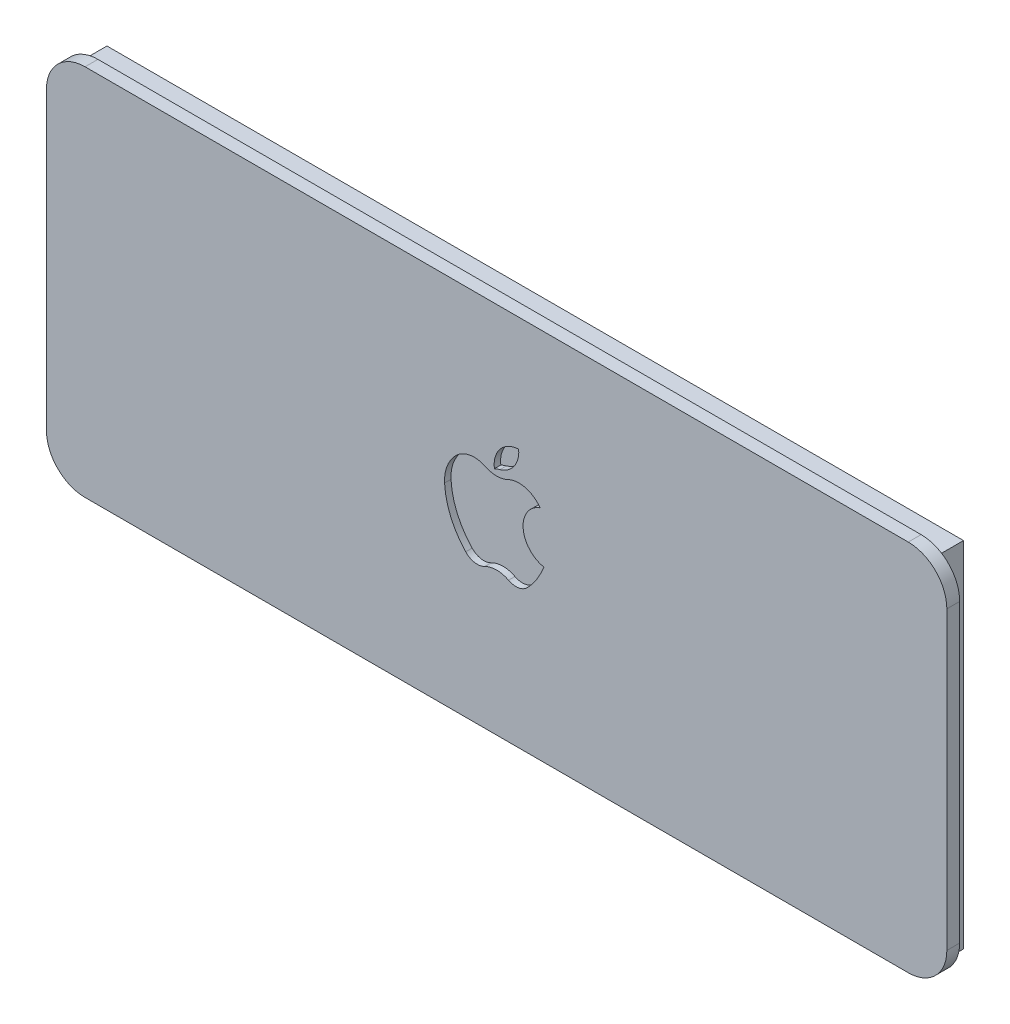
ISO-10303-21;
HEADER;
FILE_DESCRIPTION(('STEP AP214'),'2;1');
FILE_NAME('part.step','',(''),(''),'','','');
FILE_SCHEMA(('AUTOMOTIVE_DESIGN { 1 0 10303 214 1 1 1 1 }'));
ENDSEC;
DATA;
#1=APPLICATION_CONTEXT('core data for automotive mechanical design processes');
#2=APPLICATION_PROTOCOL_DEFINITION('international standard','automotive_design',2000,#1);
#3=PRODUCT_CONTEXT('',#1,'mechanical');
#4=PRODUCT('Part','Part','',(#3));
#5=PRODUCT_RELATED_PRODUCT_CATEGORY('part','',(#4));
#6=PRODUCT_DEFINITION_FORMATION('','',#4);
#7=PRODUCT_DEFINITION_CONTEXT('part definition',#1,'design');
#8=PRODUCT_DEFINITION('design','',#6,#7);
#9=PRODUCT_DEFINITION_SHAPE('','',#8);
#10=(LENGTH_UNIT() NAMED_UNIT(*) SI_UNIT(.MILLI.,.METRE.));
#11=(NAMED_UNIT(*) PLANE_ANGLE_UNIT() SI_UNIT($,.RADIAN.));
#12=(NAMED_UNIT(*) SI_UNIT($,.STERADIAN.) SOLID_ANGLE_UNIT());
#13=UNCERTAINTY_MEASURE_WITH_UNIT(LENGTH_MEASURE(1.E-05),#10,'distance_accuracy_value','');
#14=(GEOMETRIC_REPRESENTATION_CONTEXT(3) GLOBAL_UNCERTAINTY_ASSIGNED_CONTEXT((#13)) GLOBAL_UNIT_ASSIGNED_CONTEXT((#10,
#11,#12)) REPRESENTATION_CONTEXT('',''));
#15=CARTESIAN_POINT('',(0.,0.,0.));
#16=DIRECTION('',(0.,0.,1.));
#17=DIRECTION('',(1.,0.,0.));
#18=AXIS2_PLACEMENT_3D('',#15,#16,#17);
#19=CARTESIAN_POINT('',(-64.,-23.,0.));
#20=DIRECTION('',(0.,0.,-1.));
#21=DIRECTION('',(-1.,0.,0.));
#22=AXIS2_PLACEMENT_3D('',#19,#20,#21);
#23=PLANE('',#22);
#24=CARTESIAN_POINT('',(-64.,-23.,0.));
#25=DIRECTION('',(0.,0.,1.));
#26=DIRECTION('',(-1.,0.,0.));
#27=AXIS2_PLACEMENT_3D('',#24,#25,#26);
#28=CIRCLE('',#27,6.);
#29=CARTESIAN_POINT('',(-70.,-23.,0.));
#30=VERTEX_POINT('',#29);
#31=CARTESIAN_POINT('',(-64.,-29.,0.));
#32=VERTEX_POINT('',#31);
#33=EDGE_CURVE('E407',#30,#32,#28,.T.);
#34=ORIENTED_EDGE('',*,*,#33,.F.);
#35=DIRECTION('',(0.,-1.,0.));
#36=VECTOR('',#35,1.);
#37=CARTESIAN_POINT('',(-70.,23.,0.));
#38=LINE('',#37,#36);
#39=CARTESIAN_POINT('',(-70.,23.,0.));
#40=VERTEX_POINT('',#39);
#41=EDGE_CURVE('E416',#40,#30,#38,.T.);
#42=ORIENTED_EDGE('',*,*,#41,.F.);
#43=CARTESIAN_POINT('',(-64.,23.,0.));
#44=DIRECTION('',(0.,0.,1.));
#45=DIRECTION('',(-1.,0.,0.));
#46=AXIS2_PLACEMENT_3D('',#43,#44,#45);
#47=CIRCLE('',#46,6.);
#48=CARTESIAN_POINT('',(-64.,29.,0.));
#49=VERTEX_POINT('',#48);
#50=EDGE_CURVE('E443',#49,#40,#47,.T.);
#51=ORIENTED_EDGE('',*,*,#50,.F.);
#52=DIRECTION('',(-1.,0.,0.));
#53=VECTOR('',#52,1.);
#54=CARTESIAN_POINT('',(-64.,29.,0.));
#55=LINE('',#54,#53);
#56=CARTESIAN_POINT('',(64.,29.,0.));
#57=VERTEX_POINT('',#56);
#58=EDGE_CURVE('E441',#57,#49,#55,.T.);
#59=ORIENTED_EDGE('',*,*,#58,.F.);
#60=CARTESIAN_POINT('',(64.,23.,0.));
#61=DIRECTION('',(0.,0.,1.));
#62=DIRECTION('',(-1.,0.,0.));
#63=AXIS2_PLACEMENT_3D('',#60,#61,#62);
#64=CIRCLE('',#63,5.99999999999999);
#65=CARTESIAN_POINT('',(70.,23.,0.));
#66=VERTEX_POINT('',#65);
#67=EDGE_CURVE('E439',#66,#57,#64,.T.);
#68=ORIENTED_EDGE('',*,*,#67,.F.);
#69=DIRECTION('',(0.,1.,0.));
#70=VECTOR('',#69,1.);
#71=CARTESIAN_POINT('',(70.,23.,0.));
#72=LINE('',#71,#70);
#73=CARTESIAN_POINT('',(70.,-23.,0.));
#74=VERTEX_POINT('',#73);
#75=EDGE_CURVE('E437',#74,#66,#72,.T.);
#76=ORIENTED_EDGE('',*,*,#75,.F.);
#77=CARTESIAN_POINT('',(64.,-23.,0.));
#78=DIRECTION('',(0.,0.,1.));
#79=DIRECTION('',(1.,0.,0.));
#80=AXIS2_PLACEMENT_3D('',#77,#78,#79);
#81=CIRCLE('',#80,6.);
#82=CARTESIAN_POINT('',(64.,-29.,0.));
#83=VERTEX_POINT('',#82);
#84=EDGE_CURVE('E435',#83,#74,#81,.T.);
#85=ORIENTED_EDGE('',*,*,#84,.F.);
#86=DIRECTION('',(1.,0.,0.));
#87=VECTOR('',#86,1.);
#88=CARTESIAN_POINT('',(-64.,-29.,0.));
#89=LINE('',#88,#87);
#90=EDGE_CURVE('E433',#32,#83,#89,.T.);
#91=ORIENTED_EDGE('',*,*,#90,.F.);
#92=EDGE_LOOP('',(#34,#42,#51,#59,#68,#76,#85,#91));
#93=FACE_BOUND('',#92,.T.);
#94=DIRECTION('',(1.,0.,0.));
#95=VECTOR('',#94,1.);
#96=CARTESIAN_POINT('',(66.595,27.5,0.));
#97=LINE('',#96,#95);
#98=CARTESIAN_POINT('',(-66.595,27.5,0.));
#99=VERTEX_POINT('',#98);
#100=CARTESIAN_POINT('',(66.595,27.5,0.));
#101=VERTEX_POINT('',#100);
#102=EDGE_CURVE('E286',#99,#101,#97,.T.);
#103=ORIENTED_EDGE('',*,*,#102,.F.);
#104=DIRECTION('',(0.,1.,0.));
#105=VECTOR('',#104,1.);
#106=CARTESIAN_POINT('',(-66.595,27.5,0.));
#107=LINE('',#106,#105);
#108=CARTESIAN_POINT('',(-66.595,-27.5,0.));
#109=VERTEX_POINT('',#108);
#110=EDGE_CURVE('E251',#109,#99,#107,.T.);
#111=ORIENTED_EDGE('',*,*,#110,.F.);
#112=DIRECTION('',(-1.,0.,0.));
#113=VECTOR('',#112,1.);
#114=CARTESIAN_POINT('',(66.595,-27.5,0.));
#115=LINE('',#114,#113);
#116=CARTESIAN_POINT('',(66.595,-27.5,0.));
#117=VERTEX_POINT('',#116);
#118=EDGE_CURVE('E277',#117,#109,#115,.T.);
#119=ORIENTED_EDGE('',*,*,#118,.F.);
#120=DIRECTION('',(0.,-1.,0.));
#121=VECTOR('',#120,1.);
#122=CARTESIAN_POINT('',(66.595,27.5,0.));
#123=LINE('',#122,#121);
#124=EDGE_CURVE('E288',#101,#117,#123,.T.);
#125=ORIENTED_EDGE('',*,*,#124,.F.);
#126=EDGE_LOOP('',(#103,#111,#119,#125));
#127=FACE_BOUND('',#126,.T.);
#128=ADVANCED_FACE('F35',(#93,#127),#23,.T.);
#129=CARTESIAN_POINT('',(-64.,-23.,2.));
#130=DIRECTION('',(0.,0.,-1.));
#131=DIRECTION('',(-1.,0.,0.));
#132=AXIS2_PLACEMENT_3D('',#129,#130,#131);
#133=PLANE('',#132);
#134=CARTESIAN_POINT('',(3.00000000000302,-4.99999999999894,2.));
#135=DIRECTION('',(0.,0.,1.));
#136=DIRECTION('',(1.,0.,0.));
#137=AXIS2_PLACEMENT_3D('',#134,#135,#136);
#138=CIRCLE('',#137,2.5);
#139=CARTESIAN_POINT('',(1.84615384615686,-7.21780049897409,2.));
#140=VERTEX_POINT('',#139);
#141=CARTESIAN_POINT('',(4.81172183967402,-6.7226909112361,2.));
#142=VERTEX_POINT('',#141);
#143=EDGE_CURVE('E336',#140,#142,#138,.T.);
#144=ORIENTED_EDGE('',*,*,#143,.F.);
#145=CARTESIAN_POINT('',(3.01733464602716E-12,-10.7662812973343,2.));
#146=DIRECTION('',(0.,0.,-1.));
#147=DIRECTION('',(1.,0.,0.));
#148=AXIS2_PLACEMENT_3D('',#145,#146,#147);
#149=CIRCLE('',#148,4.);
#150=CARTESIAN_POINT('',(-1.84615384615083,-7.21780049897409,2.));
#151=VERTEX_POINT('',#150);
#152=EDGE_CURVE('E299',#151,#140,#149,.T.);
#153=ORIENTED_EDGE('',*,*,#152,.F.);
#154=CARTESIAN_POINT('',(-2.99999999999698,-4.99999999999894,2.));
#155=DIRECTION('',(0.,0.,1.));
#156=DIRECTION('',(-1.,0.,0.));
#157=AXIS2_PLACEMENT_3D('',#154,#155,#156);
#158=CIRCLE('',#157,2.5);
#159=CARTESIAN_POINT('',(-4.81172183966798,-6.7226909112361,2.));
#160=VERTEX_POINT('',#159);
#161=EDGE_CURVE('E304',#160,#151,#158,.T.);
#162=ORIENTED_EDGE('',*,*,#161,.F.);
#163=CARTESIAN_POINT('',(3.88454299074971,1.54622546270555,2.));
#164=DIRECTION('',(0.,0.,1.));
#165=DIRECTION('',(1.,0.,0.));
#166=AXIS2_PLACEMENT_3D('',#163,#164,#165);
#167=CIRCLE('',#166,12.0000000000001);
#168=CARTESIAN_POINT('',(-8.09823615563702,0.903571645381691,2.));
#169=VERTEX_POINT('',#168);
#170=EDGE_CURVE('E360',#169,#160,#167,.T.);
#171=ORIENTED_EDGE('',*,*,#170,.F.);
#172=CARTESIAN_POINT('',(-2.10684658244364,1.22489855404145,2.));
#173=DIRECTION('',(0.,0.,1.));
#174=DIRECTION('',(1.,0.,0.));
#175=AXIS2_PLACEMENT_3D('',#172,#173,#174);
#176=CIRCLE('',#175,6.00000000000002);
#177=CARTESIAN_POINT('',(-6.21130683511307,5.60135899991058,2.));
#178=VERTEX_POINT('',#177);
#179=EDGE_CURVE('E357',#178,#169,#176,.T.);
#180=ORIENTED_EDGE('',*,*,#179,.F.);
#181=CARTESIAN_POINT('',(-3.475,2.6837187026646,2.));
#182=DIRECTION('',(0.,0.,1.));
#183=DIRECTION('',(1.,0.,0.));
#184=AXIS2_PLACEMENT_3D('',#181,#182,#183);
#185=CIRCLE('',#184,4.00000000000002);
#186=CARTESIAN_POINT('',(-1.73749999999999,6.28664719904086,2.));
#187=VERTEX_POINT('',#186);
#188=EDGE_CURVE('E354',#187,#178,#185,.T.);
#189=ORIENTED_EDGE('',*,*,#188,.F.);
#190=CARTESIAN_POINT('',(-2.85177697428862E-11,9.88957569543071,2.));
#191=DIRECTION('',(0.,0.,-1.));
#192=DIRECTION('',(1.,0.,0.));
#193=AXIS2_PLACEMENT_3D('',#190,#191,#192);
#194=CIRCLE('',#193,3.99999999999988);
#195=CARTESIAN_POINT('',(1.73749999997143,6.28664719905457,2.));
#196=VERTEX_POINT('',#195);
#197=EDGE_CURVE('E351',#196,#187,#194,.T.);
#198=ORIENTED_EDGE('',*,*,#197,.F.);
#199=CARTESIAN_POINT('',(3.47500000026505,2.68371870281979,2.));
#200=DIRECTION('',(0.,0.,1.));
#201=DIRECTION('',(-1.,0.,0.));
#202=AXIS2_PLACEMENT_3D('',#199,#200,#201);
#203=CIRCLE('',#202,4.00000000000012);
#204=CARTESIAN_POINT('',(6.21130683554235,5.60135899991189,2.));
#205=VERTEX_POINT('',#204);
#206=EDGE_CURVE('E348',#205,#196,#203,.T.);
#207=ORIENTED_EDGE('',*,*,#206,.F.);
#208=CARTESIAN_POINT('',(2.10684658287288,1.22489855404202,2.));
#209=DIRECTION('',(0.,0.,1.));
#210=DIRECTION('',(-1.,0.,0.));
#211=AXIS2_PLACEMENT_3D('',#208,#209,#210);
#212=CIRCLE('',#211,6.00000000000059);
#213=CARTESIAN_POINT('',(6.77351324954047,4.99613472037007,2.));
#214=VERTEX_POINT('',#213);
#215=EDGE_CURVE('E345',#214,#205,#212,.T.);
#216=ORIENTED_EDGE('',*,*,#215,.F.);
#217=CARTESIAN_POINT('',(8.10684658287352,1.22489855404202,2.));
#218=DIRECTION('',(0.,0.,-1.));
#219=DIRECTION('',(1.,0.,0.));
#220=AXIS2_PLACEMENT_3D('',#217,#218,#219);
#221=CIRCLE('',#220,3.99999999999972);
#222=CARTESIAN_POINT('',(7.3388179922104,-2.70067555478866,2.));
#223=VERTEX_POINT('',#222);
#224=EDGE_CURVE('E342',#223,#214,#221,.T.);
#225=ORIENTED_EDGE('',*,*,#224,.F.);
#226=CARTESIAN_POINT('',(-3.8845429902968,1.54622546318177,2.));
#227=DIRECTION('',(0.,0.,1.));
#228=DIRECTION('',(-1.,0.,0.));
#229=AXIS2_PLACEMENT_3D('',#226,#227,#228);
#230=CIRCLE('',#229,12.0000000000043);
#231=EDGE_CURVE('E339',#142,#223,#230,.T.);
#232=ORIENTED_EDGE('',*,*,#231,.F.);
#233=EDGE_LOOP('',(#144,#153,#162,#171,#180,#189,#198,#207,#216,#225,#232));
#234=FACE_BOUND('',#233,.T.);
#235=CARTESIAN_POINT('',(-64.,-23.,2.));
#236=DIRECTION('',(0.,0.,1.));
#237=DIRECTION('',(-1.,0.,0.));
#238=AXIS2_PLACEMENT_3D('',#235,#236,#237);
#239=CIRCLE('',#238,6.);
#240=CARTESIAN_POINT('',(-70.,-23.,2.));
#241=VERTEX_POINT('',#240);
#242=CARTESIAN_POINT('',(-64.,-29.,2.));
#243=VERTEX_POINT('',#242);
#244=EDGE_CURVE('E412',#241,#243,#239,.T.);
#245=ORIENTED_EDGE('',*,*,#244,.T.);
#246=DIRECTION('',(1.,0.,0.));
#247=VECTOR('',#246,1.);
#248=CARTESIAN_POINT('',(-64.,-29.,2.));
#249=LINE('',#248,#247);
#250=CARTESIAN_POINT('',(64.,-29.,2.));
#251=VERTEX_POINT('',#250);
#252=EDGE_CURVE('E415',#243,#251,#249,.T.);
#253=ORIENTED_EDGE('',*,*,#252,.T.);
#254=CARTESIAN_POINT('',(64.,-23.,2.));
#255=DIRECTION('',(0.,0.,1.));
#256=DIRECTION('',(1.,0.,0.));
#257=AXIS2_PLACEMENT_3D('',#254,#255,#256);
#258=CIRCLE('',#257,6.);
#259=CARTESIAN_POINT('',(70.,-23.,2.));
#260=VERTEX_POINT('',#259);
#261=EDGE_CURVE('E418',#251,#260,#258,.T.);
#262=ORIENTED_EDGE('',*,*,#261,.T.);
#263=DIRECTION('',(0.,1.,0.));
#264=VECTOR('',#263,1.);
#265=CARTESIAN_POINT('',(70.,23.,2.));
#266=LINE('',#265,#264);
#267=CARTESIAN_POINT('',(70.,23.,2.));
#268=VERTEX_POINT('',#267);
#269=EDGE_CURVE('E420',#260,#268,#266,.T.);
#270=ORIENTED_EDGE('',*,*,#269,.T.);
#271=CARTESIAN_POINT('',(64.,23.,2.));
#272=DIRECTION('',(0.,0.,1.));
#273=DIRECTION('',(-1.,0.,0.));
#274=AXIS2_PLACEMENT_3D('',#271,#272,#273);
#275=CIRCLE('',#274,5.99999999999999);
#276=CARTESIAN_POINT('',(64.,29.,2.));
#277=VERTEX_POINT('',#276);
#278=EDGE_CURVE('E422',#268,#277,#275,.T.);
#279=ORIENTED_EDGE('',*,*,#278,.T.);
#280=DIRECTION('',(-1.,0.,0.));
#281=VECTOR('',#280,1.);
#282=CARTESIAN_POINT('',(-64.,29.,2.));
#283=LINE('',#282,#281);
#284=CARTESIAN_POINT('',(-64.,29.,2.));
#285=VERTEX_POINT('',#284);
#286=EDGE_CURVE('E424',#277,#285,#283,.T.);
#287=ORIENTED_EDGE('',*,*,#286,.T.);
#288=CARTESIAN_POINT('',(-64.,23.,2.));
#289=DIRECTION('',(0.,0.,1.));
#290=DIRECTION('',(-1.,0.,0.));
#291=AXIS2_PLACEMENT_3D('',#288,#289,#290);
#292=CIRCLE('',#291,6.);
#293=CARTESIAN_POINT('',(-70.,23.,2.));
#294=VERTEX_POINT('',#293);
#295=EDGE_CURVE('E426',#285,#294,#292,.T.);
#296=ORIENTED_EDGE('',*,*,#295,.T.);
#297=DIRECTION('',(0.,-1.,0.));
#298=VECTOR('',#297,1.);
#299=CARTESIAN_POINT('',(-70.,23.,2.));
#300=LINE('',#299,#298);
#301=EDGE_CURVE('E428',#294,#241,#300,.T.);
#302=ORIENTED_EDGE('',*,*,#301,.T.);
#303=EDGE_LOOP('',(#245,#253,#262,#270,#279,#287,#296,#302));
#304=FACE_BOUND('',#303,.T.);
#305=CARTESIAN_POINT('',(2.10684658287288,1.22489855404202,2.));
#306=DIRECTION('',(0.,0.,-1.));
#307=DIRECTION('',(-1.,0.,0.));
#308=AXIS2_PLACEMENT_3D('',#305,#306,#307);
#309=CIRCLE('',#308,6.00000000000063);
#310=CARTESIAN_POINT('',(-0.354358224239168,6.69686994445116,2.));
#311=VERTEX_POINT('',#310);
#312=CARTESIAN_POINT('',(0.506524653439716,7.00754238901775,2.));
#313=VERTEX_POINT('',#312);
#314=EDGE_CURVE('E400',#311,#313,#309,.T.);
#315=ORIENTED_EDGE('',*,*,#314,.F.);
#316=CARTESIAN_POINT('',(3.61063683092017,7.22489855404166,2.));
#317=DIRECTION('',(0.,0.,1.));
#318=DIRECTION('',(1.,0.,0.));
#319=AXIS2_PLACEMENT_3D('',#316,#317,#318);
#320=CIRCLE('',#319,3.99999999999801);
#321=CARTESIAN_POINT('',(3.42360098065179,11.2205233600887,2.));
#322=VERTEX_POINT('',#321);
#323=EDGE_CURVE('E367',#322,#311,#320,.T.);
#324=ORIENTED_EDGE('',*,*,#323,.F.);
#325=CARTESIAN_POINT('',(-0.560356633303887,10.8626382790118,2.));
#326=DIRECTION('',(0.,0.,1.));
#327=DIRECTION('',(1.,0.,0.));
#328=AXIS2_PLACEMENT_3D('',#325,#326,#327);
#329=CIRCLE('',#328,4.0000000001316);
#330=EDGE_CURVE('E392',#313,#322,#329,.T.);
#331=ORIENTED_EDGE('',*,*,#330,.F.);
#332=EDGE_LOOP('',(#315,#324,#331));
#333=FACE_BOUND('',#332,.T.);
#334=ADVANCED_FACE('F486',(#234,#304,#333),#133,.F.);
#335=CARTESIAN_POINT('',(-64.,-23.,2.));
#336=DIRECTION('',(0.,0.,-1.));
#337=DIRECTION('',(-1.,0.,0.));
#338=AXIS2_PLACEMENT_3D('',#335,#336,#337);
#339=CYLINDRICAL_SURFACE('',#338,6.);
#340=ORIENTED_EDGE('',*,*,#33,.T.);
#341=DIRECTION('',(0.,0.,-1.));
#342=VECTOR('',#341,1.);
#343=CARTESIAN_POINT('',(-64.,-29.,2.));
#344=LINE('',#343,#342);
#345=EDGE_CURVE('E11',#243,#32,#344,.T.);
#346=ORIENTED_EDGE('',*,*,#345,.F.);
#347=ORIENTED_EDGE('',*,*,#244,.F.);
#348=DIRECTION('',(0.,0.,-1.));
#349=VECTOR('',#348,1.);
#350=CARTESIAN_POINT('',(-70.,-23.,2.));
#351=LINE('',#350,#349);
#352=EDGE_CURVE('E430',#241,#30,#351,.T.);
#353=ORIENTED_EDGE('',*,*,#352,.T.);
#354=EDGE_LOOP('',(#340,#346,#347,#353));
#355=FACE_BOUND('',#354,.T.);
#356=ADVANCED_FACE('F37',(#355),#339,.T.);
#357=CARTESIAN_POINT('',(-64.,-29.,2.));
#358=DIRECTION('',(0.,1.,0.));
#359=DIRECTION('',(0.,0.,1.));
#360=AXIS2_PLACEMENT_3D('',#357,#358,#359);
#361=PLANE('',#360);
#362=ORIENTED_EDGE('',*,*,#90,.T.);
#363=DIRECTION('',(0.,0.,-1.));
#364=VECTOR('',#363,1.);
#365=CARTESIAN_POINT('',(64.,-29.,2.));
#366=LINE('',#365,#364);
#367=EDGE_CURVE('E43',#251,#83,#366,.T.);
#368=ORIENTED_EDGE('',*,*,#367,.F.);
#369=ORIENTED_EDGE('',*,*,#252,.F.);
#370=ORIENTED_EDGE('',*,*,#345,.T.);
#371=EDGE_LOOP('',(#362,#368,#369,#370));
#372=FACE_BOUND('',#371,.T.);
#373=ADVANCED_FACE('F491',(#372),#361,.F.);
#374=CARTESIAN_POINT('',(64.,-23.,2.));
#375=DIRECTION('',(0.,0.,-1.));
#376=DIRECTION('',(-1.,0.,0.));
#377=AXIS2_PLACEMENT_3D('',#374,#375,#376);
#378=CYLINDRICAL_SURFACE('',#377,6.);
#379=ORIENTED_EDGE('',*,*,#84,.T.);
#380=DIRECTION('',(0.,0.,-1.));
#381=VECTOR('',#380,1.);
#382=CARTESIAN_POINT('',(70.,-23.,2.));
#383=LINE('',#382,#381);
#384=EDGE_CURVE('E460',#260,#74,#383,.T.);
#385=ORIENTED_EDGE('',*,*,#384,.F.);
#386=ORIENTED_EDGE('',*,*,#261,.F.);
#387=ORIENTED_EDGE('',*,*,#367,.T.);
#388=EDGE_LOOP('',(#379,#385,#386,#387));
#389=FACE_BOUND('',#388,.T.);
#390=ADVANCED_FACE('F467',(#389),#378,.T.);
#391=CARTESIAN_POINT('',(70.,23.,2.));
#392=DIRECTION('',(-1.,0.,0.));
#393=DIRECTION('',(0.,0.,1.));
#394=AXIS2_PLACEMENT_3D('',#391,#392,#393);
#395=PLANE('',#394);
#396=ORIENTED_EDGE('',*,*,#75,.T.);
#397=DIRECTION('',(0.,0.,-1.));
#398=VECTOR('',#397,1.);
#399=CARTESIAN_POINT('',(70.,23.,2.));
#400=LINE('',#399,#398);
#401=EDGE_CURVE('E457',#268,#66,#400,.T.);
#402=ORIENTED_EDGE('',*,*,#401,.F.);
#403=ORIENTED_EDGE('',*,*,#269,.F.);
#404=ORIENTED_EDGE('',*,*,#384,.T.);
#405=EDGE_LOOP('',(#396,#402,#403,#404));
#406=FACE_BOUND('',#405,.T.);
#407=ADVANCED_FACE('F478',(#406),#395,.F.);
#408=CARTESIAN_POINT('',(64.,23.,2.));
#409=DIRECTION('',(0.,0.,-1.));
#410=DIRECTION('',(-1.,0.,0.));
#411=AXIS2_PLACEMENT_3D('',#408,#409,#410);
#412=CYLINDRICAL_SURFACE('',#411,5.99999999999999);
#413=ORIENTED_EDGE('',*,*,#67,.T.);
#414=DIRECTION('',(0.,0.,-1.));
#415=VECTOR('',#414,1.);
#416=CARTESIAN_POINT('',(64.,29.,2.));
#417=LINE('',#416,#415);
#418=EDGE_CURVE('E454',#277,#57,#417,.T.);
#419=ORIENTED_EDGE('',*,*,#418,.F.);
#420=ORIENTED_EDGE('',*,*,#278,.F.);
#421=ORIENTED_EDGE('',*,*,#401,.T.);
#422=EDGE_LOOP('',(#413,#419,#420,#421));
#423=FACE_BOUND('',#422,.T.);
#424=ADVANCED_FACE('F482',(#423),#412,.T.);
#425=CARTESIAN_POINT('',(-64.,29.,2.));
#426=DIRECTION('',(0.,-1.,0.));
#427=DIRECTION('',(0.,0.,-1.));
#428=AXIS2_PLACEMENT_3D('',#425,#426,#427);
#429=PLANE('',#428);
#430=ORIENTED_EDGE('',*,*,#58,.T.);
#431=DIRECTION('',(0.,0.,-1.));
#432=VECTOR('',#431,1.);
#433=CARTESIAN_POINT('',(-64.,29.,2.));
#434=LINE('',#433,#432);
#435=EDGE_CURVE('E451',#285,#49,#434,.T.);
#436=ORIENTED_EDGE('',*,*,#435,.F.);
#437=ORIENTED_EDGE('',*,*,#286,.F.);
#438=ORIENTED_EDGE('',*,*,#418,.T.);
#439=EDGE_LOOP('',(#430,#436,#437,#438));
#440=FACE_BOUND('',#439,.T.);
#441=ADVANCED_FACE('F504',(#440),#429,.F.);
#442=CARTESIAN_POINT('',(-64.,23.,2.));
#443=DIRECTION('',(0.,0.,-1.));
#444=DIRECTION('',(-1.,0.,0.));
#445=AXIS2_PLACEMENT_3D('',#442,#443,#444);
#446=CYLINDRICAL_SURFACE('',#445,6.);
#447=ORIENTED_EDGE('',*,*,#50,.T.);
#448=DIRECTION('',(0.,0.,-1.));
#449=VECTOR('',#448,1.);
#450=CARTESIAN_POINT('',(-70.,23.,2.));
#451=LINE('',#450,#449);
#452=EDGE_CURVE('E448',#294,#40,#451,.T.);
#453=ORIENTED_EDGE('',*,*,#452,.F.);
#454=ORIENTED_EDGE('',*,*,#295,.F.);
#455=ORIENTED_EDGE('',*,*,#435,.T.);
#456=EDGE_LOOP('',(#447,#453,#454,#455));
#457=FACE_BOUND('',#456,.T.);
#458=ADVANCED_FACE('F502',(#457),#446,.T.);
#459=CARTESIAN_POINT('',(-70.,23.,2.));
#460=DIRECTION('',(1.,0.,0.));
#461=DIRECTION('',(0.,0.,-1.));
#462=AXIS2_PLACEMENT_3D('',#459,#460,#461);
#463=PLANE('',#462);
#464=ORIENTED_EDGE('',*,*,#41,.T.);
#465=ORIENTED_EDGE('',*,*,#352,.F.);
#466=ORIENTED_EDGE('',*,*,#301,.F.);
#467=ORIENTED_EDGE('',*,*,#452,.T.);
#468=EDGE_LOOP('',(#464,#465,#466,#467));
#469=FACE_BOUND('',#468,.T.);
#470=ADVANCED_FACE('F497',(#469),#463,.F.);
#471=CARTESIAN_POINT('',(3.61063683092017,7.22489855404166,1.));
#472=DIRECTION('',(0.,0.,1.));
#473=DIRECTION('',(1.,0.,0.));
#474=AXIS2_PLACEMENT_3D('',#471,#472,#473);
#475=CYLINDRICAL_SURFACE('',#474,3.99999999999801);
#476=ORIENTED_EDGE('',*,*,#323,.T.);
#477=DIRECTION('',(0.,0.,1.));
#478=VECTOR('',#477,1.);
#479=CARTESIAN_POINT('',(-0.354358224239168,6.69686994445116,1.));
#480=LINE('',#479,#478);
#481=CARTESIAN_POINT('',(-0.354358224239168,6.69686994445116,1.));
#482=VERTEX_POINT('',#481);
#483=EDGE_CURVE('E398',#482,#311,#480,.T.);
#484=ORIENTED_EDGE('',*,*,#483,.F.);
#485=CARTESIAN_POINT('',(3.61063683092017,7.22489855404166,1.));
#486=DIRECTION('',(0.,0.,1.));
#487=DIRECTION('',(1.,0.,0.));
#488=AXIS2_PLACEMENT_3D('',#485,#486,#487);
#489=CIRCLE('',#488,3.99999999999801);
#490=CARTESIAN_POINT('',(3.42360098065179,11.2205233600887,1.));
#491=VERTEX_POINT('',#490);
#492=EDGE_CURVE('E388',#491,#482,#489,.T.);
#493=ORIENTED_EDGE('',*,*,#492,.F.);
#494=DIRECTION('',(0.,0.,1.));
#495=VECTOR('',#494,1.);
#496=CARTESIAN_POINT('',(3.42360098065179,11.2205233600887,1.));
#497=LINE('',#496,#495);
#498=EDGE_CURVE('E405',#491,#322,#497,.T.);
#499=ORIENTED_EDGE('',*,*,#498,.T.);
#500=EDGE_LOOP('',(#476,#484,#493,#499));
#501=FACE_BOUND('',#500,.T.);
#502=ADVANCED_FACE('F615',(#501),#475,.F.);
#503=CARTESIAN_POINT('',(-0.560356633303887,10.8626382790118,1.));
#504=DIRECTION('',(0.,0.,1.));
#505=DIRECTION('',(1.,0.,0.));
#506=AXIS2_PLACEMENT_3D('',#503,#504,#505);
#507=CYLINDRICAL_SURFACE('',#506,4.0000000001316);
#508=ORIENTED_EDGE('',*,*,#330,.T.);
#509=ORIENTED_EDGE('',*,*,#498,.F.);
#510=CARTESIAN_POINT('',(-0.560356633303887,10.8626382790118,1.));
#511=DIRECTION('',(0.,0.,1.));
#512=DIRECTION('',(1.,0.,0.));
#513=AXIS2_PLACEMENT_3D('',#510,#511,#512);
#514=CIRCLE('',#513,4.0000000001316);
#515=CARTESIAN_POINT('',(0.506524653439716,7.00754238901775,1.));
#516=VERTEX_POINT('',#515);
#517=EDGE_CURVE('E395',#516,#491,#514,.T.);
#518=ORIENTED_EDGE('',*,*,#517,.F.);
#519=DIRECTION('',(0.,0.,1.));
#520=VECTOR('',#519,1.);
#521=CARTESIAN_POINT('',(0.506524653439716,7.00754238901775,1.));
#522=LINE('',#521,#520);
#523=EDGE_CURVE('E408',#516,#313,#522,.T.);
#524=ORIENTED_EDGE('',*,*,#523,.T.);
#525=EDGE_LOOP('',(#508,#509,#518,#524));
#526=FACE_BOUND('',#525,.T.);
#527=ADVANCED_FACE('F612',(#526),#507,.F.);
#528=CARTESIAN_POINT('',(2.10684658287288,1.22489855404202,1.));
#529=DIRECTION('',(0.,0.,1.));
#530=DIRECTION('',(1.,0.,0.));
#531=AXIS2_PLACEMENT_3D('',#528,#529,#530);
#532=CYLINDRICAL_SURFACE('',#531,6.00000000000063);
#533=ORIENTED_EDGE('',*,*,#314,.T.);
#534=ORIENTED_EDGE('',*,*,#523,.F.);
#535=CARTESIAN_POINT('',(2.10684658287288,1.22489855404202,1.));
#536=DIRECTION('',(0.,0.,-1.));
#537=DIRECTION('',(-1.,0.,0.));
#538=AXIS2_PLACEMENT_3D('',#535,#536,#537);
#539=CIRCLE('',#538,6.00000000000063);
#540=EDGE_CURVE('E391',#482,#516,#539,.T.);
#541=ORIENTED_EDGE('',*,*,#540,.F.);
#542=ORIENTED_EDGE('',*,*,#483,.T.);
#543=EDGE_LOOP('',(#533,#534,#541,#542));
#544=FACE_BOUND('',#543,.T.);
#545=ADVANCED_FACE('F610',(#544),#532,.T.);
#546=CARTESIAN_POINT('',(2.85874170689653,4.22489855404184,1.));
#547=DIRECTION('',(0.,0.,1.));
#548=DIRECTION('',(1.,0.,0.));
#549=AXIS2_PLACEMENT_3D('',#546,#547,#548);
#550=PLANE('',#549);
#551=ORIENTED_EDGE('',*,*,#492,.T.);
#552=ORIENTED_EDGE('',*,*,#540,.T.);
#553=ORIENTED_EDGE('',*,*,#517,.T.);
#554=EDGE_LOOP('',(#551,#552,#553));
#555=FACE_BOUND('',#554,.T.);
#556=ADVANCED_FACE('F606',(#555),#550,.T.);
#557=CARTESIAN_POINT('',(3.01733464602716E-12,-10.7662812973343,1.));
#558=DIRECTION('',(0.,0.,1.));
#559=DIRECTION('',(1.,0.,0.));
#560=AXIS2_PLACEMENT_3D('',#557,#558,#559);
#561=CYLINDRICAL_SURFACE('',#560,4.);
#562=ORIENTED_EDGE('',*,*,#152,.T.);
#563=DIRECTION('',(0.,0.,1.));
#564=VECTOR('',#563,1.);
#565=CARTESIAN_POINT('',(1.84615384615686,-7.21780049897409,1.));
#566=LINE('',#565,#564);
#567=CARTESIAN_POINT('',(1.84615384615686,-7.21780049897409,1.));
#568=VERTEX_POINT('',#567);
#569=EDGE_CURVE('E334',#568,#140,#566,.T.);
#570=ORIENTED_EDGE('',*,*,#569,.F.);
#571=CARTESIAN_POINT('',(3.01733464602716E-12,-10.7662812973343,1.));
#572=DIRECTION('',(0.,0.,-1.));
#573=DIRECTION('',(1.,0.,0.));
#574=AXIS2_PLACEMENT_3D('',#571,#572,#573);
#575=CIRCLE('',#574,4.);
#576=CARTESIAN_POINT('',(-1.84615384615083,-7.21780049897409,1.));
#577=VERTEX_POINT('',#576);
#578=EDGE_CURVE('E300',#577,#568,#575,.T.);
#579=ORIENTED_EDGE('',*,*,#578,.F.);
#580=DIRECTION('',(0.,0.,1.));
#581=VECTOR('',#580,1.);
#582=CARTESIAN_POINT('',(-1.84615384615083,-7.21780049897409,1.));
#583=LINE('',#582,#581);
#584=EDGE_CURVE('E365',#577,#151,#583,.T.);
#585=ORIENTED_EDGE('',*,*,#584,.T.);
#586=EDGE_LOOP('',(#562,#570,#579,#585));
#587=FACE_BOUND('',#586,.T.);
#588=ADVANCED_FACE('F568',(#587),#561,.T.);
#589=CARTESIAN_POINT('',(-2.99999999999698,-4.99999999999894,1.));
#590=DIRECTION('',(0.,0.,1.));
#591=DIRECTION('',(1.,0.,0.));
#592=AXIS2_PLACEMENT_3D('',#589,#590,#591);
#593=CYLINDRICAL_SURFACE('',#592,2.5);
#594=ORIENTED_EDGE('',*,*,#161,.T.);
#595=ORIENTED_EDGE('',*,*,#584,.F.);
#596=CARTESIAN_POINT('',(-2.99999999999698,-4.99999999999894,1.));
#597=DIRECTION('',(0.,0.,1.));
#598=DIRECTION('',(-1.,0.,0.));
#599=AXIS2_PLACEMENT_3D('',#596,#597,#598);
#600=CIRCLE('',#599,2.5);
#601=CARTESIAN_POINT('',(-4.81172183966798,-6.7226909112361,1.));
#602=VERTEX_POINT('',#601);
#603=EDGE_CURVE('E331',#602,#577,#600,.T.);
#604=ORIENTED_EDGE('',*,*,#603,.F.);
#605=DIRECTION('',(0.,0.,1.));
#606=VECTOR('',#605,1.);
#607=CARTESIAN_POINT('',(-4.81172183966798,-6.7226909112361,1.));
#608=LINE('',#607,#606);
#609=EDGE_CURVE('E368',#602,#160,#608,.T.);
#610=ORIENTED_EDGE('',*,*,#609,.T.);
#611=EDGE_LOOP('',(#594,#595,#604,#610));
#612=FACE_BOUND('',#611,.T.);
#613=ADVANCED_FACE('F564',(#612),#593,.F.);
#614=CARTESIAN_POINT('',(3.88454299074971,1.54622546270555,1.));
#615=DIRECTION('',(0.,0.,1.));
#616=DIRECTION('',(1.,0.,0.));
#617=AXIS2_PLACEMENT_3D('',#614,#615,#616);
#618=CYLINDRICAL_SURFACE('',#617,12.0000000000001);
#619=ORIENTED_EDGE('',*,*,#170,.T.);
#620=ORIENTED_EDGE('',*,*,#609,.F.);
#621=CARTESIAN_POINT('',(3.88454299074971,1.54622546270555,1.));
#622=DIRECTION('',(0.,0.,1.));
#623=DIRECTION('',(1.,0.,0.));
#624=AXIS2_PLACEMENT_3D('',#621,#622,#623);
#625=CIRCLE('',#624,12.0000000000001);
#626=CARTESIAN_POINT('',(-8.09823615563702,0.903571645381691,1.));
#627=VERTEX_POINT('',#626);
#628=EDGE_CURVE('E328',#627,#602,#625,.T.);
#629=ORIENTED_EDGE('',*,*,#628,.F.);
#630=DIRECTION('',(0.,0.,1.));
#631=VECTOR('',#630,1.);
#632=CARTESIAN_POINT('',(-8.09823615563702,0.903571645381691,1.));
#633=LINE('',#632,#631);
#634=EDGE_CURVE('E370',#627,#169,#633,.T.);
#635=ORIENTED_EDGE('',*,*,#634,.T.);
#636=EDGE_LOOP('',(#619,#620,#629,#635));
#637=FACE_BOUND('',#636,.T.);
#638=ADVANCED_FACE('F567',(#637),#618,.F.);
#639=CARTESIAN_POINT('',(-2.10684658244364,1.22489855404145,1.));
#640=DIRECTION('',(0.,0.,1.));
#641=DIRECTION('',(1.,0.,0.));
#642=AXIS2_PLACEMENT_3D('',#639,#640,#641);
#643=CYLINDRICAL_SURFACE('',#642,6.00000000000002);
#644=ORIENTED_EDGE('',*,*,#179,.T.);
#645=ORIENTED_EDGE('',*,*,#634,.F.);
#646=CARTESIAN_POINT('',(-2.10684658244364,1.22489855404145,1.));
#647=DIRECTION('',(0.,0.,1.));
#648=DIRECTION('',(1.,0.,0.));
#649=AXIS2_PLACEMENT_3D('',#646,#647,#648);
#650=CIRCLE('',#649,6.00000000000002);
#651=CARTESIAN_POINT('',(-6.21130683511307,5.60135899991058,1.));
#652=VERTEX_POINT('',#651);
#653=EDGE_CURVE('E325',#652,#627,#650,.T.);
#654=ORIENTED_EDGE('',*,*,#653,.F.);
#655=DIRECTION('',(0.,0.,1.));
#656=VECTOR('',#655,1.);
#657=CARTESIAN_POINT('',(-6.21130683511307,5.60135899991058,1.));
#658=LINE('',#657,#656);
#659=EDGE_CURVE('E372',#652,#178,#658,.T.);
#660=ORIENTED_EDGE('',*,*,#659,.T.);
#661=EDGE_LOOP('',(#644,#645,#654,#660));
#662=FACE_BOUND('',#661,.T.);
#663=ADVANCED_FACE('F572',(#662),#643,.F.);
#664=CARTESIAN_POINT('',(-3.475,2.6837187026646,1.));
#665=DIRECTION('',(0.,0.,1.));
#666=DIRECTION('',(1.,0.,0.));
#667=AXIS2_PLACEMENT_3D('',#664,#665,#666);
#668=CYLINDRICAL_SURFACE('',#667,4.00000000000002);
#669=ORIENTED_EDGE('',*,*,#188,.T.);
#670=ORIENTED_EDGE('',*,*,#659,.F.);
#671=CARTESIAN_POINT('',(-3.475,2.6837187026646,1.));
#672=DIRECTION('',(0.,0.,1.));
#673=DIRECTION('',(1.,0.,0.));
#674=AXIS2_PLACEMENT_3D('',#671,#672,#673);
#675=CIRCLE('',#674,4.00000000000002);
#676=CARTESIAN_POINT('',(-1.73749999999999,6.28664719904086,1.));
#677=VERTEX_POINT('',#676);
#678=EDGE_CURVE('E322',#677,#652,#675,.T.);
#679=ORIENTED_EDGE('',*,*,#678,.F.);
#680=DIRECTION('',(0.,0.,1.));
#681=VECTOR('',#680,1.);
#682=CARTESIAN_POINT('',(-1.73749999999999,6.28664719904086,1.));
#683=LINE('',#682,#681);
#684=EDGE_CURVE('E374',#677,#187,#683,.T.);
#685=ORIENTED_EDGE('',*,*,#684,.T.);
#686=EDGE_LOOP('',(#669,#670,#679,#685));
#687=FACE_BOUND('',#686,.T.);
#688=ADVANCED_FACE('F576',(#687),#668,.F.);
#689=CARTESIAN_POINT('',(-2.85177697428862E-11,9.88957569543071,1.));
#690=DIRECTION('',(0.,0.,1.));
#691=DIRECTION('',(1.,0.,0.));
#692=AXIS2_PLACEMENT_3D('',#689,#690,#691);
#693=CYLINDRICAL_SURFACE('',#692,3.99999999999988);
#694=ORIENTED_EDGE('',*,*,#197,.T.);
#695=ORIENTED_EDGE('',*,*,#684,.F.);
#696=CARTESIAN_POINT('',(-2.85177697428862E-11,9.88957569543071,1.));
#697=DIRECTION('',(0.,0.,-1.));
#698=DIRECTION('',(1.,0.,0.));
#699=AXIS2_PLACEMENT_3D('',#696,#697,#698);
#700=CIRCLE('',#699,3.99999999999988);
#701=CARTESIAN_POINT('',(1.73749999997143,6.28664719905457,1.));
#702=VERTEX_POINT('',#701);
#703=EDGE_CURVE('E319',#702,#677,#700,.T.);
#704=ORIENTED_EDGE('',*,*,#703,.F.);
#705=DIRECTION('',(0.,0.,1.));
#706=VECTOR('',#705,1.);
#707=CARTESIAN_POINT('',(1.73749999997143,6.28664719905457,1.));
#708=LINE('',#707,#706);
#709=EDGE_CURVE('E376',#702,#196,#708,.T.);
#710=ORIENTED_EDGE('',*,*,#709,.T.);
#711=EDGE_LOOP('',(#694,#695,#704,#710));
#712=FACE_BOUND('',#711,.T.);
#713=ADVANCED_FACE('F580',(#712),#693,.T.);
#714=CARTESIAN_POINT('',(3.47500000026505,2.68371870281979,1.));
#715=DIRECTION('',(0.,0.,1.));
#716=DIRECTION('',(1.,0.,0.));
#717=AXIS2_PLACEMENT_3D('',#714,#715,#716);
#718=CYLINDRICAL_SURFACE('',#717,4.00000000000012);
#719=ORIENTED_EDGE('',*,*,#206,.T.);
#720=ORIENTED_EDGE('',*,*,#709,.F.);
#721=CARTESIAN_POINT('',(3.47500000026505,2.68371870281979,1.));
#722=DIRECTION('',(0.,0.,1.));
#723=DIRECTION('',(-1.,0.,0.));
#724=AXIS2_PLACEMENT_3D('',#721,#722,#723);
#725=CIRCLE('',#724,4.00000000000012);
#726=CARTESIAN_POINT('',(6.21130683554235,5.60135899991189,1.));
#727=VERTEX_POINT('',#726);
#728=EDGE_CURVE('E316',#727,#702,#725,.T.);
#729=ORIENTED_EDGE('',*,*,#728,.F.);
#730=DIRECTION('',(0.,0.,1.));
#731=VECTOR('',#730,1.);
#732=CARTESIAN_POINT('',(6.21130683554235,5.60135899991189,1.));
#733=LINE('',#732,#731);
#734=EDGE_CURVE('E378',#727,#205,#733,.T.);
#735=ORIENTED_EDGE('',*,*,#734,.T.);
#736=EDGE_LOOP('',(#719,#720,#729,#735));
#737=FACE_BOUND('',#736,.T.);
#738=ADVANCED_FACE('F584',(#737),#718,.F.);
#739=CARTESIAN_POINT('',(2.10684658287288,1.22489855404202,1.));
#740=DIRECTION('',(0.,0.,1.));
#741=DIRECTION('',(1.,0.,0.));
#742=AXIS2_PLACEMENT_3D('',#739,#740,#741);
#743=CYLINDRICAL_SURFACE('',#742,6.00000000000059);
#744=ORIENTED_EDGE('',*,*,#215,.T.);
#745=ORIENTED_EDGE('',*,*,#734,.F.);
#746=CARTESIAN_POINT('',(2.10684658287288,1.22489855404202,1.));
#747=DIRECTION('',(0.,0.,1.));
#748=DIRECTION('',(-1.,0.,0.));
#749=AXIS2_PLACEMENT_3D('',#746,#747,#748);
#750=CIRCLE('',#749,6.00000000000059);
#751=CARTESIAN_POINT('',(6.77351324954047,4.99613472037007,1.));
#752=VERTEX_POINT('',#751);
#753=EDGE_CURVE('E313',#752,#727,#750,.T.);
#754=ORIENTED_EDGE('',*,*,#753,.F.);
#755=DIRECTION('',(0.,0.,1.));
#756=VECTOR('',#755,1.);
#757=CARTESIAN_POINT('',(6.77351324954047,4.99613472037007,1.));
#758=LINE('',#757,#756);
#759=EDGE_CURVE('E380',#752,#214,#758,.T.);
#760=ORIENTED_EDGE('',*,*,#759,.T.);
#761=EDGE_LOOP('',(#744,#745,#754,#760));
#762=FACE_BOUND('',#761,.T.);
#763=ADVANCED_FACE('F588',(#762),#743,.F.);
#764=CARTESIAN_POINT('',(8.10684658287352,1.22489855404202,1.));
#765=DIRECTION('',(0.,0.,1.));
#766=DIRECTION('',(1.,0.,0.));
#767=AXIS2_PLACEMENT_3D('',#764,#765,#766);
#768=CYLINDRICAL_SURFACE('',#767,3.99999999999972);
#769=ORIENTED_EDGE('',*,*,#224,.T.);
#770=ORIENTED_EDGE('',*,*,#759,.F.);
#771=CARTESIAN_POINT('',(8.10684658287352,1.22489855404202,1.));
#772=DIRECTION('',(0.,0.,-1.));
#773=DIRECTION('',(1.,0.,0.));
#774=AXIS2_PLACEMENT_3D('',#771,#772,#773);
#775=CIRCLE('',#774,3.99999999999972);
#776=CARTESIAN_POINT('',(7.3388179922104,-2.70067555478866,1.));
#777=VERTEX_POINT('',#776);
#778=EDGE_CURVE('E310',#777,#752,#775,.T.);
#779=ORIENTED_EDGE('',*,*,#778,.F.);
#780=DIRECTION('',(0.,0.,1.));
#781=VECTOR('',#780,1.);
#782=CARTESIAN_POINT('',(7.3388179922104,-2.70067555478866,1.));
#783=LINE('',#782,#781);
#784=EDGE_CURVE('E382',#777,#223,#783,.T.);
#785=ORIENTED_EDGE('',*,*,#784,.T.);
#786=EDGE_LOOP('',(#769,#770,#779,#785));
#787=FACE_BOUND('',#786,.T.);
#788=ADVANCED_FACE('F592',(#787),#768,.T.);
#789=CARTESIAN_POINT('',(-3.8845429902968,1.54622546318177,1.));
#790=DIRECTION('',(0.,0.,1.));
#791=DIRECTION('',(1.,0.,0.));
#792=AXIS2_PLACEMENT_3D('',#789,#790,#791);
#793=CYLINDRICAL_SURFACE('',#792,12.0000000000043);
#794=ORIENTED_EDGE('',*,*,#231,.T.);
#795=ORIENTED_EDGE('',*,*,#784,.F.);
#796=CARTESIAN_POINT('',(-3.8845429902968,1.54622546318177,1.));
#797=DIRECTION('',(0.,0.,1.));
#798=DIRECTION('',(-1.,0.,0.));
#799=AXIS2_PLACEMENT_3D('',#796,#797,#798);
#800=CIRCLE('',#799,12.0000000000043);
#801=CARTESIAN_POINT('',(4.81172183967402,-6.7226909112361,1.));
#802=VERTEX_POINT('',#801);
#803=EDGE_CURVE('E307',#802,#777,#800,.T.);
#804=ORIENTED_EDGE('',*,*,#803,.F.);
#805=DIRECTION('',(0.,0.,1.));
#806=VECTOR('',#805,1.);
#807=CARTESIAN_POINT('',(4.81172183967402,-6.7226909112361,1.));
#808=LINE('',#807,#806);
#809=EDGE_CURVE('E384',#802,#142,#808,.T.);
#810=ORIENTED_EDGE('',*,*,#809,.T.);
#811=EDGE_LOOP('',(#794,#795,#804,#810));
#812=FACE_BOUND('',#811,.T.);
#813=ADVANCED_FACE('F596',(#812),#793,.F.);
#814=CARTESIAN_POINT('',(3.00000000000302,-4.99999999999894,1.));
#815=DIRECTION('',(0.,0.,1.));
#816=DIRECTION('',(1.,0.,0.));
#817=AXIS2_PLACEMENT_3D('',#814,#815,#816);
#818=CYLINDRICAL_SURFACE('',#817,2.5);
#819=ORIENTED_EDGE('',*,*,#143,.T.);
#820=ORIENTED_EDGE('',*,*,#809,.F.);
#821=CARTESIAN_POINT('',(3.00000000000302,-4.99999999999894,1.));
#822=DIRECTION('',(0.,0.,1.));
#823=DIRECTION('',(1.,0.,0.));
#824=AXIS2_PLACEMENT_3D('',#821,#822,#823);
#825=CIRCLE('',#824,2.5);
#826=EDGE_CURVE('E303',#568,#802,#825,.T.);
#827=ORIENTED_EDGE('',*,*,#826,.F.);
#828=ORIENTED_EDGE('',*,*,#569,.T.);
#829=EDGE_LOOP('',(#819,#820,#827,#828));
#830=FACE_BOUND('',#829,.T.);
#831=ADVANCED_FACE('F562',(#830),#818,.F.);
#832=CARTESIAN_POINT('',(-1.49999999999698,-7.88314064866664,1.));
#833=DIRECTION('',(0.,0.,1.));
#834=DIRECTION('',(1.,0.,0.));
#835=AXIS2_PLACEMENT_3D('',#832,#833,#834);
#836=PLANE('',#835);
#837=ORIENTED_EDGE('',*,*,#578,.T.);
#838=ORIENTED_EDGE('',*,*,#826,.T.);
#839=ORIENTED_EDGE('',*,*,#803,.T.);
#840=ORIENTED_EDGE('',*,*,#778,.T.);
#841=ORIENTED_EDGE('',*,*,#753,.T.);
#842=ORIENTED_EDGE('',*,*,#728,.T.);
#843=ORIENTED_EDGE('',*,*,#703,.T.);
#844=ORIENTED_EDGE('',*,*,#678,.T.);
#845=ORIENTED_EDGE('',*,*,#653,.T.);
#846=ORIENTED_EDGE('',*,*,#628,.T.);
#847=ORIENTED_EDGE('',*,*,#603,.T.);
#848=EDGE_LOOP('',(#837,#838,#839,#840,#841,#842,#843,#844,#845,#846,#847));
#849=FACE_BOUND('',#848,.T.);
#850=ADVANCED_FACE('F545',(#849),#836,.T.);
#851=CARTESIAN_POINT('',(0.,0.,-4.));
#852=DIRECTION('',(0.,0.,-1.));
#853=DIRECTION('',(-1.,0.,0.));
#854=AXIS2_PLACEMENT_3D('',#851,#852,#853);
#855=PLANE('',#854);
#856=DIRECTION('',(0.,1.,0.));
#857=VECTOR('',#856,1.);
#858=CARTESIAN_POINT('',(-66.595,27.5,-4.));
#859=LINE('',#858,#857);
#860=CARTESIAN_POINT('',(-66.595,-27.5,-4.));
#861=VERTEX_POINT('',#860);
#862=CARTESIAN_POINT('',(-66.595,27.5,-4.));
#863=VERTEX_POINT('',#862);
#864=EDGE_CURVE('E273',#861,#863,#859,.T.);
#865=ORIENTED_EDGE('',*,*,#864,.T.);
#866=DIRECTION('',(1.,0.,0.));
#867=VECTOR('',#866,1.);
#868=CARTESIAN_POINT('',(66.595,27.5,-4.));
#869=LINE('',#868,#867);
#870=CARTESIAN_POINT('',(66.595,27.5,-4.));
#871=VERTEX_POINT('',#870);
#872=EDGE_CURVE('E276',#863,#871,#869,.T.);
#873=ORIENTED_EDGE('',*,*,#872,.T.);
#874=DIRECTION('',(0.,-1.,0.));
#875=VECTOR('',#874,1.);
#876=CARTESIAN_POINT('',(66.595,27.5,-4.));
#877=LINE('',#876,#875);
#878=CARTESIAN_POINT('',(66.595,-27.5,-4.));
#879=VERTEX_POINT('',#878);
#880=EDGE_CURVE('E279',#871,#879,#877,.T.);
#881=ORIENTED_EDGE('',*,*,#880,.T.);
#882=DIRECTION('',(-1.,0.,0.));
#883=VECTOR('',#882,1.);
#884=CARTESIAN_POINT('',(66.595,-27.5,-4.));
#885=LINE('',#884,#883);
#886=EDGE_CURVE('E281',#879,#861,#885,.T.);
#887=ORIENTED_EDGE('',*,*,#886,.T.);
#888=EDGE_LOOP('',(#865,#873,#881,#887));
#889=FACE_BOUND('',#888,.T.);
#890=DIRECTION('',(1.,0.,0.));
#891=VECTOR('',#890,1.);
#892=CARTESIAN_POINT('',(65.095,26.8805841279375,-4.));
#893=LINE('',#892,#891);
#894=CARTESIAN_POINT('',(-65.095,26.8805841279375,-4.));
#895=VERTEX_POINT('',#894);
#896=CARTESIAN_POINT('',(65.095,26.8805841279375,-4.));
#897=VERTEX_POINT('',#896);
#898=EDGE_CURVE('E243',#895,#897,#893,.T.);
#899=ORIENTED_EDGE('',*,*,#898,.F.);
#900=DIRECTION('',(0.,1.,0.));
#901=VECTOR('',#900,1.);
#902=CARTESIAN_POINT('',(-65.095,26.8805841279375,-4.));
#903=LINE('',#902,#901);
#904=CARTESIAN_POINT('',(-65.095,-26.8805841279375,-4.));
#905=VERTEX_POINT('',#904);
#906=EDGE_CURVE('E234',#905,#895,#903,.T.);
#907=ORIENTED_EDGE('',*,*,#906,.F.);
#908=DIRECTION('',(-1.,0.,0.));
#909=VECTOR('',#908,1.);
#910=CARTESIAN_POINT('',(65.095,-26.8805841279375,-4.));
#911=LINE('',#910,#909);
#912=CARTESIAN_POINT('',(65.095,-26.8805841279375,-4.));
#913=VERTEX_POINT('',#912);
#914=EDGE_CURVE('E259',#913,#905,#911,.T.);
#915=ORIENTED_EDGE('',*,*,#914,.F.);
#916=DIRECTION('',(0.,-1.,0.));
#917=VECTOR('',#916,1.);
#918=CARTESIAN_POINT('',(65.095,26.8805841279375,-4.));
#919=LINE('',#918,#917);
#920=EDGE_CURVE('E257',#897,#913,#919,.T.);
#921=ORIENTED_EDGE('',*,*,#920,.F.);
#922=EDGE_LOOP('',(#899,#907,#915,#921));
#923=FACE_BOUND('',#922,.T.);
#924=ADVANCED_FACE('F255',(#889,#923),#855,.T.);
#925=CARTESIAN_POINT('',(-66.595,27.5,-4.));
#926=DIRECTION('',(1.,0.,0.));
#927=DIRECTION('',(0.,0.,-1.));
#928=AXIS2_PLACEMENT_3D('',#925,#926,#927);
#929=PLANE('',#928);
#930=ORIENTED_EDGE('',*,*,#110,.T.);
#931=DIRECTION('',(0.,0.,1.));
#932=VECTOR('',#931,1.);
#933=CARTESIAN_POINT('',(-66.595,27.5,-4.));
#934=LINE('',#933,#932);
#935=EDGE_CURVE('E297',#863,#99,#934,.T.);
#936=ORIENTED_EDGE('',*,*,#935,.F.);
#937=ORIENTED_EDGE('',*,*,#864,.F.);
#938=DIRECTION('',(0.,0.,1.));
#939=VECTOR('',#938,1.);
#940=CARTESIAN_POINT('',(-66.595,-27.5,-4.));
#941=LINE('',#940,#939);
#942=EDGE_CURVE('E283',#861,#109,#941,.T.);
#943=ORIENTED_EDGE('',*,*,#942,.T.);
#944=EDGE_LOOP('',(#930,#936,#937,#943));
#945=FACE_BOUND('',#944,.T.);
#946=ADVANCED_FACE('F544',(#945),#929,.F.);
#947=CARTESIAN_POINT('',(66.595,27.5,-4.));
#948=DIRECTION('',(0.,-1.,0.));
#949=DIRECTION('',(0.,0.,-1.));
#950=AXIS2_PLACEMENT_3D('',#947,#948,#949);
#951=PLANE('',#950);
#952=ORIENTED_EDGE('',*,*,#102,.T.);
#953=DIRECTION('',(0.,0.,1.));
#954=VECTOR('',#953,1.);
#955=CARTESIAN_POINT('',(66.595,27.5,-4.));
#956=LINE('',#955,#954);
#957=EDGE_CURVE('E294',#871,#101,#956,.T.);
#958=ORIENTED_EDGE('',*,*,#957,.F.);
#959=ORIENTED_EDGE('',*,*,#872,.F.);
#960=ORIENTED_EDGE('',*,*,#935,.T.);
#961=EDGE_LOOP('',(#952,#958,#959,#960));
#962=FACE_BOUND('',#961,.T.);
#963=ADVANCED_FACE('F552',(#962),#951,.F.);
#964=CARTESIAN_POINT('',(66.595,27.5,-4.));
#965=DIRECTION('',(-1.,0.,0.));
#966=DIRECTION('',(0.,0.,1.));
#967=AXIS2_PLACEMENT_3D('',#964,#965,#966);
#968=PLANE('',#967);
#969=ORIENTED_EDGE('',*,*,#124,.T.);
#970=DIRECTION('',(0.,0.,1.));
#971=VECTOR('',#970,1.);
#972=CARTESIAN_POINT('',(66.595,-27.5,-4.));
#973=LINE('',#972,#971);
#974=EDGE_CURVE('E50',#879,#117,#973,.T.);
#975=ORIENTED_EDGE('',*,*,#974,.F.);
#976=ORIENTED_EDGE('',*,*,#880,.F.);
#977=ORIENTED_EDGE('',*,*,#957,.T.);
#978=EDGE_LOOP('',(#969,#975,#976,#977));
#979=FACE_BOUND('',#978,.T.);
#980=ADVANCED_FACE('F549',(#979),#968,.F.);
#981=CARTESIAN_POINT('',(66.595,-27.5,-4.));
#982=DIRECTION('',(0.,1.,0.));
#983=DIRECTION('',(0.,0.,1.));
#984=AXIS2_PLACEMENT_3D('',#981,#982,#983);
#985=PLANE('',#984);
#986=ORIENTED_EDGE('',*,*,#118,.T.);
#987=ORIENTED_EDGE('',*,*,#942,.F.);
#988=ORIENTED_EDGE('',*,*,#886,.F.);
#989=ORIENTED_EDGE('',*,*,#974,.T.);
#990=EDGE_LOOP('',(#986,#987,#988,#989));
#991=FACE_BOUND('',#990,.T.);
#992=ADVANCED_FACE('F541',(#991),#985,.F.);
#993=CARTESIAN_POINT('',(-65.095,26.8805841279375,-4.));
#994=DIRECTION('',(1.,0.,0.));
#995=DIRECTION('',(0.,0.,-1.));
#996=AXIS2_PLACEMENT_3D('',#993,#994,#995);
#997=PLANE('',#996);
#998=DIRECTION('',(0.,1.,0.));
#999=VECTOR('',#998,1.);
#1000=CARTESIAN_POINT('',(-65.095,26.8805841279375,0.));
#1001=LINE('',#1000,#999);
#1002=CARTESIAN_POINT('',(-65.095,-26.8805841279375,0.));
#1003=VERTEX_POINT('',#1002);
#1004=CARTESIAN_POINT('',(-65.095,26.8805841279375,0.));
#1005=VERTEX_POINT('',#1004);
#1006=EDGE_CURVE('E58',#1003,#1005,#1001,.T.);
#1007=ORIENTED_EDGE('',*,*,#1006,.F.);
#1008=DIRECTION('',(0.,0.,1.));
#1009=VECTOR('',#1008,1.);
#1010=CARTESIAN_POINT('',(-65.095,-26.8805841279375,-4.));
#1011=LINE('',#1010,#1009);
#1012=EDGE_CURVE('E239',#905,#1003,#1011,.T.);
#1013=ORIENTED_EDGE('',*,*,#1012,.F.);
#1014=ORIENTED_EDGE('',*,*,#906,.T.);
#1015=DIRECTION('',(0.,0.,1.));
#1016=VECTOR('',#1015,1.);
#1017=CARTESIAN_POINT('',(-65.095,26.8805841279375,-4.));
#1018=LINE('',#1017,#1016);
#1019=EDGE_CURVE('E237',#895,#1005,#1018,.T.);
#1020=ORIENTED_EDGE('',*,*,#1019,.T.);
#1021=EDGE_LOOP('',(#1007,#1013,#1014,#1020));
#1022=FACE_BOUND('',#1021,.T.);
#1023=ADVANCED_FACE('F236',(#1022),#997,.T.);
#1024=CARTESIAN_POINT('',(65.095,26.8805841279375,-4.));
#1025=DIRECTION('',(0.,-1.,0.));
#1026=DIRECTION('',(0.,0.,-1.));
#1027=AXIS2_PLACEMENT_3D('',#1024,#1025,#1026);
#1028=PLANE('',#1027);
#1029=DIRECTION('',(1.,0.,0.));
#1030=VECTOR('',#1029,1.);
#1031=CARTESIAN_POINT('',(65.095,26.8805841279375,0.));
#1032=LINE('',#1031,#1030);
#1033=CARTESIAN_POINT('',(65.095,26.8805841279375,0.));
#1034=VERTEX_POINT('',#1033);
#1035=EDGE_CURVE('E250',#1005,#1034,#1032,.T.);
#1036=ORIENTED_EDGE('',*,*,#1035,.F.);
#1037=ORIENTED_EDGE('',*,*,#1019,.F.);
#1038=ORIENTED_EDGE('',*,*,#898,.T.);
#1039=DIRECTION('',(0.,0.,1.));
#1040=VECTOR('',#1039,1.);
#1041=CARTESIAN_POINT('',(65.095,26.8805841279375,-4.));
#1042=LINE('',#1041,#1040);
#1043=EDGE_CURVE('E252',#897,#1034,#1042,.T.);
#1044=ORIENTED_EDGE('',*,*,#1043,.T.);
#1045=EDGE_LOOP('',(#1036,#1037,#1038,#1044));
#1046=FACE_BOUND('',#1045,.T.);
#1047=ADVANCED_FACE('F247',(#1046),#1028,.T.);
#1048=CARTESIAN_POINT('',(65.095,26.8805841279375,-4.));
#1049=DIRECTION('',(-1.,0.,0.));
#1050=DIRECTION('',(0.,0.,1.));
#1051=AXIS2_PLACEMENT_3D('',#1048,#1049,#1050);
#1052=PLANE('',#1051);
#1053=DIRECTION('',(0.,-1.,0.));
#1054=VECTOR('',#1053,1.);
#1055=CARTESIAN_POINT('',(65.095,26.8805841279375,0.));
#1056=LINE('',#1055,#1054);
#1057=CARTESIAN_POINT('',(65.095,-26.8805841279375,0.));
#1058=VERTEX_POINT('',#1057);
#1059=EDGE_CURVE('E265',#1034,#1058,#1056,.T.);
#1060=ORIENTED_EDGE('',*,*,#1059,.F.);
#1061=ORIENTED_EDGE('',*,*,#1043,.F.);
#1062=ORIENTED_EDGE('',*,*,#920,.T.);
#1063=DIRECTION('',(0.,0.,1.));
#1064=VECTOR('',#1063,1.);
#1065=CARTESIAN_POINT('',(65.095,-26.8805841279375,-4.));
#1066=LINE('',#1065,#1064);
#1067=EDGE_CURVE('E269',#913,#1058,#1066,.T.);
#1068=ORIENTED_EDGE('',*,*,#1067,.T.);
#1069=EDGE_LOOP('',(#1060,#1061,#1062,#1068));
#1070=FACE_BOUND('',#1069,.T.);
#1071=ADVANCED_FACE('F527',(#1070),#1052,.T.);
#1072=CARTESIAN_POINT('',(65.095,-26.8805841279375,-4.));
#1073=DIRECTION('',(0.,1.,0.));
#1074=DIRECTION('',(0.,0.,1.));
#1075=AXIS2_PLACEMENT_3D('',#1072,#1073,#1074);
#1076=PLANE('',#1075);
#1077=DIRECTION('',(-1.,0.,0.));
#1078=VECTOR('',#1077,1.);
#1079=CARTESIAN_POINT('',(65.095,-26.8805841279375,0.));
#1080=LINE('',#1079,#1078);
#1081=EDGE_CURVE('E244',#1058,#1003,#1080,.T.);
#1082=ORIENTED_EDGE('',*,*,#1081,.F.);
#1083=ORIENTED_EDGE('',*,*,#1067,.F.);
#1084=ORIENTED_EDGE('',*,*,#914,.T.);
#1085=ORIENTED_EDGE('',*,*,#1012,.T.);
#1086=EDGE_LOOP('',(#1082,#1083,#1084,#1085));
#1087=FACE_BOUND('',#1086,.T.);
#1088=ADVANCED_FACE('F523',(#1087),#1076,.T.);
#1089=ORIENTED_EDGE('',*,*,#1006,.T.);
#1090=ORIENTED_EDGE('',*,*,#1035,.T.);
#1091=ORIENTED_EDGE('',*,*,#1059,.T.);
#1092=ORIENTED_EDGE('',*,*,#1081,.T.);
#1093=EDGE_LOOP('',(#1089,#1090,#1091,#1092));
#1094=FACE_BOUND('',#1093,.T.);
#1095=ADVANCED_FACE('F515',(#1094),#23,.T.);
#1096=CLOSED_SHELL('',(#128,#334,#356,#373,#390,#407,#424,#441,#458,#470,#502,#527,#545,#556,
#588,#613,#638,#663,#688,#713,#738,#763,#788,#813,#831,#850,#924,#946,#963,#980,#992,#1023,
#1047,#1071,#1088,#1095));
#1097=MANIFOLD_SOLID_BREP('B2',#1096);
#1098=ADVANCED_BREP_SHAPE_REPRESENTATION('',(#18,#1097),#14);
#1099=SHAPE_DEFINITION_REPRESENTATION(#9,#1098);
ENDSEC;
END-ISO-10303-21;
